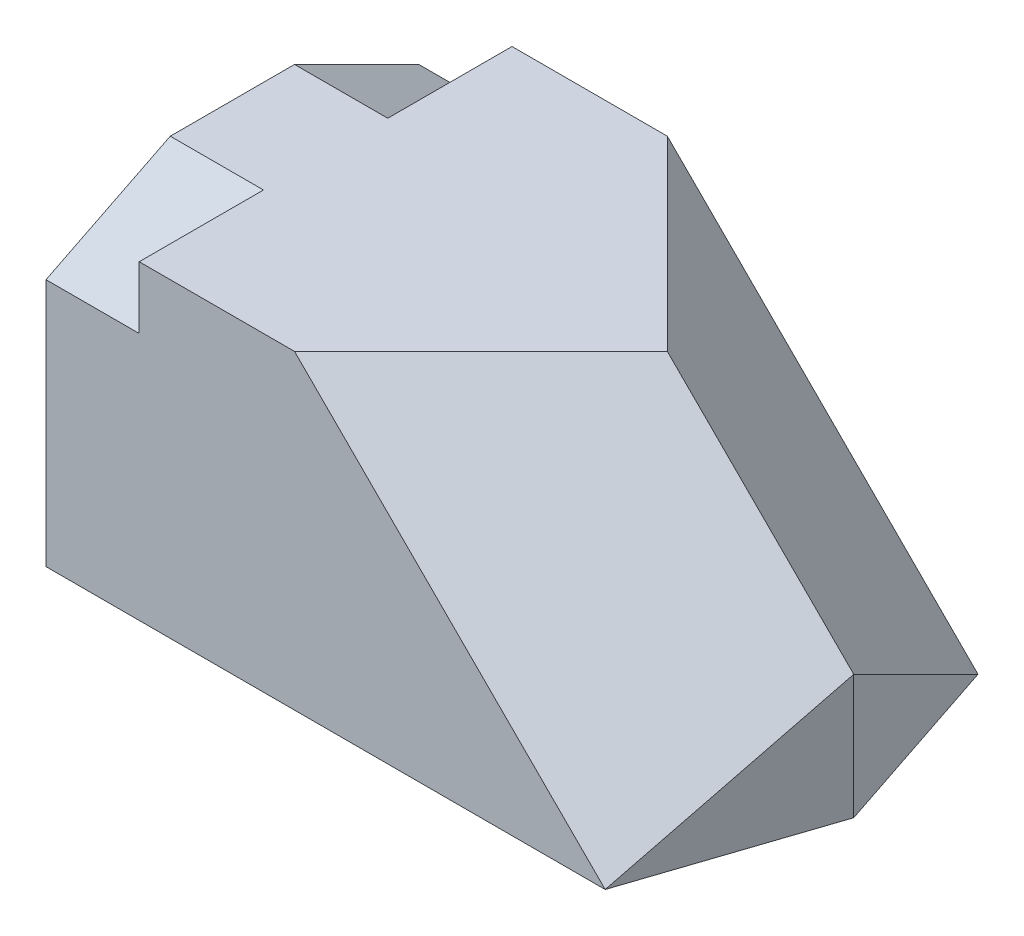
ISO-10303-21;
HEADER;
FILE_DESCRIPTION(('STEP AP214'),'2;1');
FILE_NAME('part.step','',(''),(''),'','','');
FILE_SCHEMA(('AUTOMOTIVE_DESIGN { 1 0 10303 214 1 1 1 1 }'));
ENDSEC;
DATA;
#1=APPLICATION_CONTEXT('core data for automotive mechanical design processes');
#2=APPLICATION_PROTOCOL_DEFINITION('international standard','automotive_design',2000,#1);
#3=PRODUCT_CONTEXT('',#1,'mechanical');
#4=PRODUCT('Part','Part','',(#3));
#5=PRODUCT_RELATED_PRODUCT_CATEGORY('part','',(#4));
#6=PRODUCT_DEFINITION_FORMATION('','',#4);
#7=PRODUCT_DEFINITION_CONTEXT('part definition',#1,'design');
#8=PRODUCT_DEFINITION('design','',#6,#7);
#9=PRODUCT_DEFINITION_SHAPE('','',#8);
#10=(LENGTH_UNIT() NAMED_UNIT(*) SI_UNIT(.MILLI.,.METRE.));
#11=(NAMED_UNIT(*) PLANE_ANGLE_UNIT() SI_UNIT($,.RADIAN.));
#12=(NAMED_UNIT(*) SI_UNIT($,.STERADIAN.) SOLID_ANGLE_UNIT());
#13=UNCERTAINTY_MEASURE_WITH_UNIT(LENGTH_MEASURE(1.E-05),#10,'distance_accuracy_value','');
#14=(GEOMETRIC_REPRESENTATION_CONTEXT(3) GLOBAL_UNCERTAINTY_ASSIGNED_CONTEXT((#13)) GLOBAL_UNIT_ASSIGNED_CONTEXT((#10,
#11,#12)) REPRESENTATION_CONTEXT('',''));
#15=CARTESIAN_POINT('',(0.,0.,0.));
#16=DIRECTION('',(0.,0.,1.));
#17=DIRECTION('',(1.,0.,0.));
#18=AXIS2_PLACEMENT_3D('',#15,#16,#17);
#19=CARTESIAN_POINT('',(0.,0.,-30.));
#20=DIRECTION('',(0.,0.,1.));
#21=DIRECTION('',(1.,0.,0.));
#22=AXIS2_PLACEMENT_3D('',#19,#20,#21);
#23=PLANE('',#22);
#24=DIRECTION('',(-0.707106781186547,0.707106781186548,0.));
#25=VECTOR('',#24,1.);
#26=CARTESIAN_POINT('',(95.,-5.00000000000002,-30.));
#27=LINE('',#26,#25);
#28=CARTESIAN_POINT('',(90.,0.,-30.));
#29=VERTEX_POINT('',#28);
#30=CARTESIAN_POINT('',(40.,50.,-30.));
#31=VERTEX_POINT('',#30);
#32=EDGE_CURVE('E115',#29,#31,#27,.T.);
#33=ORIENTED_EDGE('',*,*,#32,.F.);
#34=DIRECTION('',(1.,0.,0.));
#35=VECTOR('',#34,1.);
#36=CARTESIAN_POINT('',(0.,0.,-30.));
#37=LINE('',#36,#35);
#38=CARTESIAN_POINT('',(0.,0.,-30.));
#39=VERTEX_POINT('',#38);
#40=EDGE_CURVE('E134',#39,#29,#37,.T.);
#41=ORIENTED_EDGE('',*,*,#40,.F.);
#42=DIRECTION('',(0.,-1.,0.));
#43=VECTOR('',#42,1.);
#44=CARTESIAN_POINT('',(0.,50.,-30.));
#45=LINE('',#44,#43);
#46=CARTESIAN_POINT('',(0.,40.,-30.));
#47=VERTEX_POINT('',#46);
#48=EDGE_CURVE('E139',#47,#39,#45,.T.);
#49=ORIENTED_EDGE('',*,*,#48,.F.);
#50=DIRECTION('',(1.,0.,0.));
#51=VECTOR('',#50,1.);
#52=CARTESIAN_POINT('',(0.,40.,-30.));
#53=LINE('',#52,#51);
#54=CARTESIAN_POINT('',(15.,40.,-30.));
#55=VERTEX_POINT('',#54);
#56=EDGE_CURVE('E11',#47,#55,#53,.T.);
#57=ORIENTED_EDGE('',*,*,#56,.T.);
#58=DIRECTION('',(0.,1.,0.));
#59=VECTOR('',#58,1.);
#60=CARTESIAN_POINT('',(15.,50.,-30.));
#61=LINE('',#60,#59);
#62=CARTESIAN_POINT('',(15.,50.,-30.));
#63=VERTEX_POINT('',#62);
#64=EDGE_CURVE('E132',#55,#63,#61,.T.);
#65=ORIENTED_EDGE('',*,*,#64,.T.);
#66=DIRECTION('',(-1.,0.,0.));
#67=VECTOR('',#66,1.);
#68=CARTESIAN_POINT('',(100.,50.,-30.));
#69=LINE('',#68,#67);
#70=EDGE_CURVE('E54',#31,#63,#69,.T.);
#71=ORIENTED_EDGE('',*,*,#70,.F.);
#72=EDGE_LOOP('',(#33,#41,#49,#57,#65,#71));
#73=FACE_BOUND('',#72,.T.);
#74=ADVANCED_FACE('F39',(#73),#23,.F.);
#75=CARTESIAN_POINT('',(100.,50.,30.));
#76=DIRECTION('',(0.,-1.,0.));
#77=DIRECTION('',(1.,0.,0.));
#78=AXIS2_PLACEMENT_3D('',#75,#76,#77);
#79=PLANE('',#78);
#80=DIRECTION('',(-0.707106781186548,0.,-0.707106781186547));
#81=VECTOR('',#80,1.);
#82=CARTESIAN_POINT('',(70.,50.,0.));
#83=LINE('',#82,#81);
#84=CARTESIAN_POINT('',(70.,50.,0.));
#85=VERTEX_POINT('',#84);
#86=EDGE_CURVE('E117',#85,#31,#83,.T.);
#87=ORIENTED_EDGE('',*,*,#86,.T.);
#88=ORIENTED_EDGE('',*,*,#70,.T.);
#89=DIRECTION('',(0.,0.,1.));
#90=VECTOR('',#89,1.);
#91=CARTESIAN_POINT('',(15.,50.,-10.));
#92=LINE('',#91,#90);
#93=CARTESIAN_POINT('',(15.,50.,-10.));
#94=VERTEX_POINT('',#93);
#95=EDGE_CURVE('E205',#63,#94,#92,.T.);
#96=ORIENTED_EDGE('',*,*,#95,.T.);
#97=DIRECTION('',(-1.,0.,0.));
#98=VECTOR('',#97,1.);
#99=CARTESIAN_POINT('',(15.,50.,-10.));
#100=LINE('',#99,#98);
#101=CARTESIAN_POINT('',(-2.5E-06,50.,-10.));
#102=VERTEX_POINT('',#101);
#103=EDGE_CURVE('E200',#94,#102,#100,.T.);
#104=ORIENTED_EDGE('',*,*,#103,.T.);
#105=DIRECTION('',(0.,0.,-1.));
#106=VECTOR('',#105,1.);
#107=CARTESIAN_POINT('',(0.,50.,30.));
#108=LINE('',#107,#106);
#109=CARTESIAN_POINT('',(-6.E-06,50.,10.));
#110=VERTEX_POINT('',#109);
#111=EDGE_CURVE('E147',#110,#102,#108,.T.);
#112=ORIENTED_EDGE('',*,*,#111,.F.);
#113=DIRECTION('',(-1.,0.,0.));
#114=VECTOR('',#113,1.);
#115=CARTESIAN_POINT('',(15.,50.,10.));
#116=LINE('',#115,#114);
#117=CARTESIAN_POINT('',(15.,50.,10.));
#118=VERTEX_POINT('',#117);
#119=EDGE_CURVE('E168',#118,#110,#116,.T.);
#120=ORIENTED_EDGE('',*,*,#119,.F.);
#121=DIRECTION('',(0.,0.,-1.));
#122=VECTOR('',#121,1.);
#123=CARTESIAN_POINT('',(15.,50.,10.));
#124=LINE('',#123,#122);
#125=CARTESIAN_POINT('',(15.,50.,30.));
#126=VERTEX_POINT('',#125);
#127=EDGE_CURVE('E179',#126,#118,#124,.T.);
#128=ORIENTED_EDGE('',*,*,#127,.F.);
#129=DIRECTION('',(-1.,0.,0.));
#130=VECTOR('',#129,1.);
#131=CARTESIAN_POINT('',(100.,50.,30.));
#132=LINE('',#131,#130);
#133=CARTESIAN_POINT('',(40.,50.,30.));
#134=VERTEX_POINT('',#133);
#135=EDGE_CURVE('E149',#134,#126,#132,.T.);
#136=ORIENTED_EDGE('',*,*,#135,.F.);
#137=DIRECTION('',(-0.707106781186548,0.,0.707106781186547));
#138=VECTOR('',#137,1.);
#139=CARTESIAN_POINT('',(70.,50.,0.));
#140=LINE('',#139,#138);
#141=EDGE_CURVE('E128',#85,#134,#140,.T.);
#142=ORIENTED_EDGE('',*,*,#141,.F.);
#143=EDGE_LOOP('',(#87,#88,#96,#104,#112,#120,#128,#136,#142));
#144=FACE_BOUND('',#143,.T.);
#145=ADVANCED_FACE('F126',(#144),#79,.F.);
#146=CARTESIAN_POINT('',(90.,20.,-30.));
#147=DIRECTION('',(0.948683298050514,0.,-0.316227766016838));
#148=DIRECTION('',(-0.316227766016838,0.,-0.948683298050514));
#149=AXIS2_PLACEMENT_3D('',#146,#147,#148);
#150=PLANE('',#149);
#151=DIRECTION('',(0.316227766016838,0.,0.948683298050514));
#152=VECTOR('',#151,1.);
#153=CARTESIAN_POINT('',(90.,0.,-30.));
#154=LINE('',#153,#152);
#155=CARTESIAN_POINT('',(100.,0.,0.));
#156=VERTEX_POINT('',#155);
#157=EDGE_CURVE('E210',#29,#156,#154,.T.);
#158=ORIENTED_EDGE('',*,*,#157,.F.);
#159=DIRECTION('',(0.267261241912424,0.534522483824849,0.801783725737273));
#160=VECTOR('',#159,1.);
#161=CARTESIAN_POINT('',(92.8571428571429,5.7142857142857,-21.4285714285714));
#162=LINE('',#161,#160);
#163=CARTESIAN_POINT('',(100.,20.,0.));
#164=VERTEX_POINT('',#163);
#165=EDGE_CURVE('E120',#29,#164,#162,.T.);
#166=ORIENTED_EDGE('',*,*,#165,.T.);
#167=DIRECTION('',(0.,-1.,0.));
#168=VECTOR('',#167,1.);
#169=CARTESIAN_POINT('',(100.,20.,0.));
#170=LINE('',#169,#168);
#171=EDGE_CURVE('E183',#164,#156,#170,.T.);
#172=ORIENTED_EDGE('',*,*,#171,.T.);
#173=EDGE_LOOP('',(#158,#166,#172));
#174=FACE_BOUND('',#173,.T.);
#175=ADVANCED_FACE('F214',(#174),#150,.T.);
#176=CARTESIAN_POINT('',(0.,0.,30.));
#177=DIRECTION('',(0.,1.,0.));
#178=DIRECTION('',(0.,0.,1.));
#179=AXIS2_PLACEMENT_3D('',#176,#177,#178);
#180=PLANE('',#179);
#181=ORIENTED_EDGE('',*,*,#157,.T.);
#182=DIRECTION('',(0.316227766016838,0.,-0.948683298050514));
#183=VECTOR('',#182,1.);
#184=CARTESIAN_POINT('',(90.,0.,30.));
#185=LINE('',#184,#183);
#186=CARTESIAN_POINT('',(90.,0.,30.));
#187=VERTEX_POINT('',#186);
#188=EDGE_CURVE('E185',#187,#156,#185,.T.);
#189=ORIENTED_EDGE('',*,*,#188,.F.);
#190=DIRECTION('',(1.,0.,0.));
#191=VECTOR('',#190,1.);
#192=CARTESIAN_POINT('',(0.,0.,30.));
#193=LINE('',#192,#191);
#194=CARTESIAN_POINT('',(0.,0.,30.));
#195=VERTEX_POINT('',#194);
#196=EDGE_CURVE('E136',#195,#187,#193,.T.);
#197=ORIENTED_EDGE('',*,*,#196,.F.);
#198=DIRECTION('',(0.,0.,-1.));
#199=VECTOR('',#198,1.);
#200=CARTESIAN_POINT('',(0.,0.,30.));
#201=LINE('',#200,#199);
#202=EDGE_CURVE('E145',#195,#39,#201,.T.);
#203=ORIENTED_EDGE('',*,*,#202,.T.);
#204=ORIENTED_EDGE('',*,*,#40,.T.);
#205=EDGE_LOOP('',(#181,#189,#197,#203,#204));
#206=FACE_BOUND('',#205,.T.);
#207=ADVANCED_FACE('F159',(#206),#180,.F.);
#208=CARTESIAN_POINT('',(0.,50.,30.));
#209=DIRECTION('',(1.,0.,0.));
#210=DIRECTION('',(0.,0.,-1.));
#211=AXIS2_PLACEMENT_3D('',#208,#209,#210);
#212=PLANE('',#211);
#213=ORIENTED_EDGE('',*,*,#111,.T.);
#214=DIRECTION('',(0.,-0.447213595499958,-0.894427190999916));
#215=VECTOR('',#214,1.);
#216=CARTESIAN_POINT('',(0.,66.,22.));
#217=LINE('',#216,#215);
#218=EDGE_CURVE('E166',#102,#47,#217,.T.);
#219=ORIENTED_EDGE('',*,*,#218,.T.);
#220=ORIENTED_EDGE('',*,*,#48,.T.);
#221=ORIENTED_EDGE('',*,*,#202,.F.);
#222=DIRECTION('',(0.,-1.,0.));
#223=VECTOR('',#222,1.);
#224=CARTESIAN_POINT('',(0.,50.,30.));
#225=LINE('',#224,#223);
#226=CARTESIAN_POINT('',(0.,40.,30.));
#227=VERTEX_POINT('',#226);
#228=EDGE_CURVE('E133',#227,#195,#225,.T.);
#229=ORIENTED_EDGE('',*,*,#228,.F.);
#230=DIRECTION('',(0.,-0.447213595499958,0.894427190999916));
#231=VECTOR('',#230,1.);
#232=CARTESIAN_POINT('',(0.,42.,26.));
#233=LINE('',#232,#231);
#234=EDGE_CURVE('E167',#110,#227,#233,.T.);
#235=ORIENTED_EDGE('',*,*,#234,.F.);
#236=EDGE_LOOP('',(#213,#219,#220,#221,#229,#235));
#237=FACE_BOUND('',#236,.T.);
#238=ADVANCED_FACE('F41',(#237),#212,.F.);
#239=CARTESIAN_POINT('',(0.,0.,30.));
#240=DIRECTION('',(0.,0.,1.));
#241=DIRECTION('',(1.,0.,0.));
#242=AXIS2_PLACEMENT_3D('',#239,#240,#241);
#243=PLANE('',#242);
#244=DIRECTION('',(-0.707106781186547,0.707106781186548,0.));
#245=VECTOR('',#244,1.);
#246=CARTESIAN_POINT('',(95.,-5.,30.));
#247=LINE('',#246,#245);
#248=EDGE_CURVE('E191',#187,#134,#247,.T.);
#249=ORIENTED_EDGE('',*,*,#248,.T.);
#250=ORIENTED_EDGE('',*,*,#135,.T.);
#251=DIRECTION('',(0.,1.,0.));
#252=VECTOR('',#251,1.);
#253=CARTESIAN_POINT('',(15.,50.,30.));
#254=LINE('',#253,#252);
#255=CARTESIAN_POINT('',(15.,40.,30.));
#256=VERTEX_POINT('',#255);
#257=EDGE_CURVE('E181',#256,#126,#254,.T.);
#258=ORIENTED_EDGE('',*,*,#257,.F.);
#259=DIRECTION('',(-1.,0.,0.));
#260=VECTOR('',#259,1.);
#261=CARTESIAN_POINT('',(0.,40.,30.));
#262=LINE('',#261,#260);
#263=EDGE_CURVE('E47',#256,#227,#262,.T.);
#264=ORIENTED_EDGE('',*,*,#263,.T.);
#265=ORIENTED_EDGE('',*,*,#228,.T.);
#266=ORIENTED_EDGE('',*,*,#196,.T.);
#267=EDGE_LOOP('',(#249,#250,#258,#264,#265,#266));
#268=FACE_BOUND('',#267,.T.);
#269=ADVANCED_FACE('F220',(#268),#243,.T.);
#270=CARTESIAN_POINT('',(-1.2E-05,40.,30.));
#271=DIRECTION('',(0.,0.894427190999916,0.447213595499958));
#272=DIRECTION('',(0.,-0.447213595499958,0.894427190999916));
#273=AXIS2_PLACEMENT_3D('',#270,#271,#272);
#274=PLANE('',#273);
#275=ORIENTED_EDGE('',*,*,#234,.T.);
#276=ORIENTED_EDGE('',*,*,#263,.F.);
#277=DIRECTION('',(0.,-0.447213595499958,0.894427190999916));
#278=VECTOR('',#277,1.);
#279=CARTESIAN_POINT('',(15.,40.,30.));
#280=LINE('',#279,#278);
#281=EDGE_CURVE('E62',#118,#256,#280,.T.);
#282=ORIENTED_EDGE('',*,*,#281,.F.);
#283=ORIENTED_EDGE('',*,*,#119,.T.);
#284=EDGE_LOOP('',(#275,#276,#282,#283));
#285=FACE_BOUND('',#284,.T.);
#286=ADVANCED_FACE('F226',(#285),#274,.T.);
#287=CARTESIAN_POINT('',(15.,0.,0.));
#288=DIRECTION('',(-1.,0.,0.));
#289=DIRECTION('',(0.,0.,1.));
#290=AXIS2_PLACEMENT_3D('',#287,#288,#289);
#291=PLANE('',#290);
#292=ORIENTED_EDGE('',*,*,#257,.T.);
#293=ORIENTED_EDGE('',*,*,#127,.T.);
#294=ORIENTED_EDGE('',*,*,#281,.T.);
#295=EDGE_LOOP('',(#292,#293,#294));
#296=FACE_BOUND('',#295,.T.);
#297=ADVANCED_FACE('F224',(#296),#291,.T.);
#298=CARTESIAN_POINT('',(90.,20.,30.));
#299=DIRECTION('',(-0.948683298050514,0.,-0.316227766016838));
#300=DIRECTION('',(-0.316227766016838,0.,0.948683298050514));
#301=AXIS2_PLACEMENT_3D('',#298,#299,#300);
#302=PLANE('',#301);
#303=ORIENTED_EDGE('',*,*,#171,.F.);
#304=DIRECTION('',(-0.267261241912424,-0.534522483824849,0.801783725737273));
#305=VECTOR('',#304,1.);
#306=CARTESIAN_POINT('',(92.8571428571429,5.71428571428571,21.4285714285714));
#307=LINE('',#306,#305);
#308=EDGE_CURVE('E188',#164,#187,#307,.T.);
#309=ORIENTED_EDGE('',*,*,#308,.T.);
#310=ORIENTED_EDGE('',*,*,#188,.T.);
#311=EDGE_LOOP('',(#303,#309,#310));
#312=FACE_BOUND('',#311,.T.);
#313=ADVANCED_FACE('F219',(#312),#302,.F.);
#314=CARTESIAN_POINT('',(125.,-5.,0.));
#315=DIRECTION('',(-0.577350269189626,-0.577350269189626,-0.577350269189626));
#316=DIRECTION('',(-0.707106781186548,0.,0.707106781186547));
#317=AXIS2_PLACEMENT_3D('',#314,#315,#316);
#318=PLANE('',#317);
#319=DIRECTION('',(-0.707106781186547,0.707106781186548,0.));
#320=VECTOR('',#319,1.);
#321=CARTESIAN_POINT('',(125.,-5.,0.));
#322=LINE('',#321,#320);
#323=EDGE_CURVE('E192',#164,#85,#322,.T.);
#324=ORIENTED_EDGE('',*,*,#323,.T.);
#325=ORIENTED_EDGE('',*,*,#141,.T.);
#326=ORIENTED_EDGE('',*,*,#248,.F.);
#327=ORIENTED_EDGE('',*,*,#308,.F.);
#328=EDGE_LOOP('',(#324,#325,#326,#327));
#329=FACE_BOUND('',#328,.T.);
#330=ADVANCED_FACE('F217',(#329),#318,.F.);
#331=CARTESIAN_POINT('',(-6.1E-05,40.,-30.));
#332=DIRECTION('',(0.,-0.894427190999916,0.447213595499958));
#333=DIRECTION('',(0.,-0.447213595499958,-0.894427190999916));
#334=AXIS2_PLACEMENT_3D('',#331,#332,#333);
#335=PLANE('',#334);
#336=ORIENTED_EDGE('',*,*,#103,.F.);
#337=DIRECTION('',(0.,-0.447213595499958,-0.894427190999916));
#338=VECTOR('',#337,1.);
#339=CARTESIAN_POINT('',(15.,40.,-30.));
#340=LINE('',#339,#338);
#341=EDGE_CURVE('E207',#94,#55,#340,.T.);
#342=ORIENTED_EDGE('',*,*,#341,.T.);
#343=ORIENTED_EDGE('',*,*,#56,.F.);
#344=ORIENTED_EDGE('',*,*,#218,.F.);
#345=EDGE_LOOP('',(#336,#342,#343,#344));
#346=FACE_BOUND('',#345,.T.);
#347=ADVANCED_FACE('F229',(#346),#335,.F.);
#348=CARTESIAN_POINT('',(15.,0.,0.));
#349=DIRECTION('',(-1.,0.,0.));
#350=DIRECTION('',(0.,0.,-1.));
#351=AXIS2_PLACEMENT_3D('',#348,#349,#350);
#352=PLANE('',#351);
#353=ORIENTED_EDGE('',*,*,#64,.F.);
#354=ORIENTED_EDGE('',*,*,#341,.F.);
#355=ORIENTED_EDGE('',*,*,#95,.F.);
#356=EDGE_LOOP('',(#353,#354,#355));
#357=FACE_BOUND('',#356,.T.);
#358=ADVANCED_FACE('F231',(#357),#352,.T.);
#359=CARTESIAN_POINT('',(125.,-5.00000000000002,0.));
#360=DIRECTION('',(0.577350269189626,0.577350269189626,-0.577350269189626));
#361=DIRECTION('',(-0.707106781186548,0.,-0.707106781186547));
#362=AXIS2_PLACEMENT_3D('',#359,#360,#361);
#363=PLANE('',#362);
#364=ORIENTED_EDGE('',*,*,#32,.T.);
#365=ORIENTED_EDGE('',*,*,#86,.F.);
#366=ORIENTED_EDGE('',*,*,#323,.F.);
#367=ORIENTED_EDGE('',*,*,#165,.F.);
#368=EDGE_LOOP('',(#364,#365,#366,#367));
#369=FACE_BOUND('',#368,.T.);
#370=ADVANCED_FACE('F116',(#369),#363,.T.);
#371=CLOSED_SHELL('',(#74,#145,#175,#207,#238,#269,#286,#297,#313,#330,#347,#358,#370));
#372=MANIFOLD_SOLID_BREP('B2',#371);
#373=ADVANCED_BREP_SHAPE_REPRESENTATION('',(#18,#372),#14);
#374=SHAPE_DEFINITION_REPRESENTATION(#9,#373);
ENDSEC;
END-ISO-10303-21;
